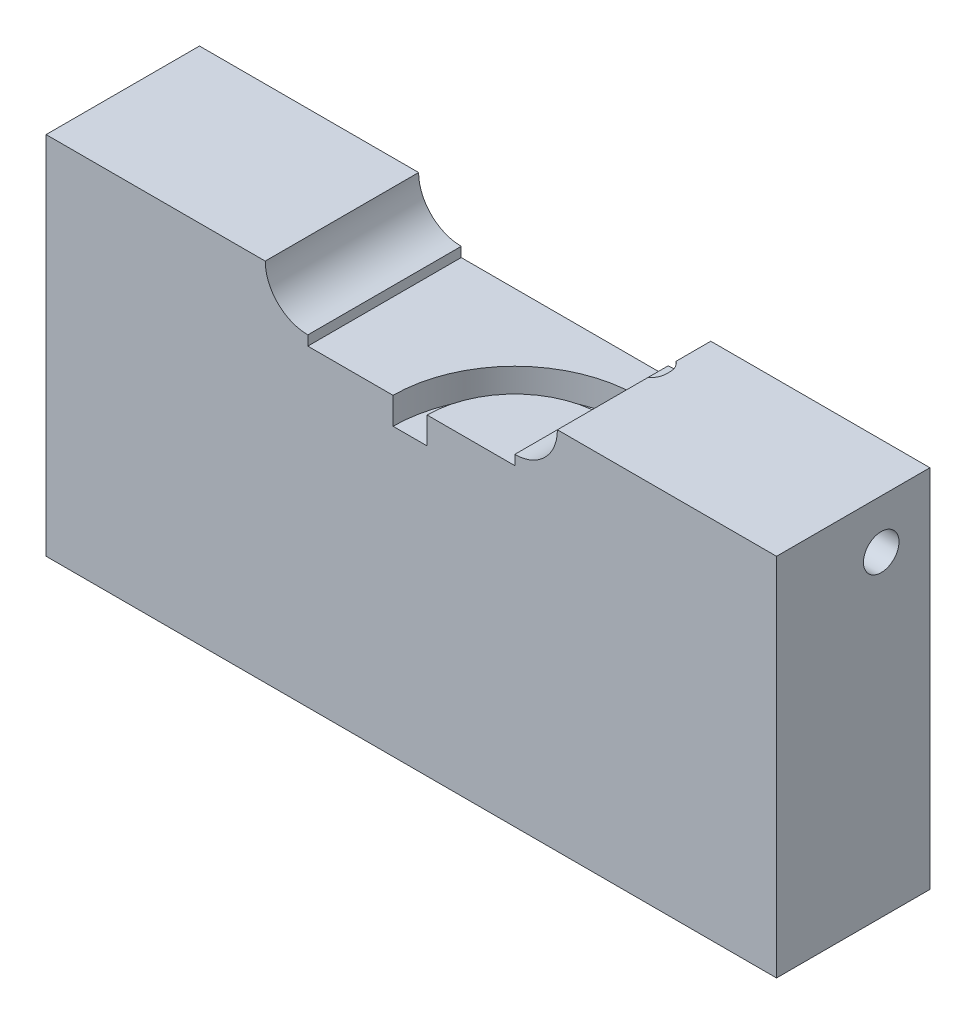
ISO-10303-21;
HEADER;
FILE_DESCRIPTION(('STEP AP214'),'2;1');
FILE_NAME('part.step','',(''),(''),'','','');
FILE_SCHEMA(('AUTOMOTIVE_DESIGN { 1 0 10303 214 1 1 1 1 }'));
ENDSEC;
DATA;
#1=APPLICATION_CONTEXT('core data for automotive mechanical design processes');
#2=APPLICATION_PROTOCOL_DEFINITION('international standard','automotive_design',2000,#1);
#3=PRODUCT_CONTEXT('',#1,'mechanical');
#4=PRODUCT('Part','Part','',(#3));
#5=PRODUCT_RELATED_PRODUCT_CATEGORY('part','',(#4));
#6=PRODUCT_DEFINITION_FORMATION('','',#4);
#7=PRODUCT_DEFINITION_CONTEXT('part definition',#1,'design');
#8=PRODUCT_DEFINITION('design','',#6,#7);
#9=PRODUCT_DEFINITION_SHAPE('','',#8);
#10=(LENGTH_UNIT() NAMED_UNIT(*) SI_UNIT(.MILLI.,.METRE.));
#11=(NAMED_UNIT(*) PLANE_ANGLE_UNIT() SI_UNIT($,.RADIAN.));
#12=(NAMED_UNIT(*) SI_UNIT($,.STERADIAN.) SOLID_ANGLE_UNIT());
#13=UNCERTAINTY_MEASURE_WITH_UNIT(LENGTH_MEASURE(1.E-05),#10,'distance_accuracy_value','');
#14=(GEOMETRIC_REPRESENTATION_CONTEXT(3) GLOBAL_UNCERTAINTY_ASSIGNED_CONTEXT((#13)) GLOBAL_UNIT_ASSIGNED_CONTEXT((#10,
#11,#12)) REPRESENTATION_CONTEXT('',''));
#15=CARTESIAN_POINT('',(0.,0.,0.));
#16=DIRECTION('',(0.,0.,1.));
#17=DIRECTION('',(1.,0.,0.));
#18=AXIS2_PLACEMENT_3D('',#15,#16,#17);
#19=CARTESIAN_POINT('',(5.39750000000001,19.05,4.0005));
#20=DIRECTION('',(0.,-1.,0.));
#21=DIRECTION('',(1.,0.,0.));
#22=AXIS2_PLACEMENT_3D('',#19,#20,#21);
#23=CYLINDRICAL_SURFACE('',#22,6.35);
#24=DIRECTION('',(0.,-1.,0.));
#25=VECTOR('',#24,1.);
#26=CARTESIAN_POINT('',(5.3975,19.05,-2.3495));
#27=LINE('',#26,#25);
#28=CARTESIAN_POINT('',(5.3975,16.3195,-2.3495));
#29=VERTEX_POINT('',#28);
#30=CARTESIAN_POINT('',(5.3975,14.9225,-2.3495));
#31=VERTEX_POINT('',#30);
#32=EDGE_CURVE('E452',#29,#31,#27,.T.);
#33=ORIENTED_EDGE('',*,*,#32,.F.);
#34=CARTESIAN_POINT('',(5.3975,16.3195,4.0005));
#35=DIRECTION('',(0.,1.,0.));
#36=DIRECTION('',(-1.,0.,0.));
#37=AXIS2_PLACEMENT_3D('',#34,#35,#36);
#38=CIRCLE('',#37,6.35);
#39=CARTESIAN_POINT('',(-0.952499999999995,16.3195,4.0005));
#40=VERTEX_POINT('',#39);
#41=EDGE_CURVE('E239',#29,#40,#38,.T.);
#42=ORIENTED_EDGE('',*,*,#41,.T.);
#43=DIRECTION('',(0.,-1.,0.));
#44=VECTOR('',#43,1.);
#45=CARTESIAN_POINT('',(-0.952499999999994,19.05,4.0005));
#46=LINE('',#45,#44);
#47=CARTESIAN_POINT('',(-0.952499999999996,14.9225,4.0005));
#48=VERTEX_POINT('',#47);
#49=EDGE_CURVE('E230',#40,#48,#46,.T.);
#50=ORIENTED_EDGE('',*,*,#49,.T.);
#51=CARTESIAN_POINT('',(5.3975,14.9225,4.0005));
#52=DIRECTION('',(0.,1.,0.));
#53=DIRECTION('',(-1.,0.,0.));
#54=AXIS2_PLACEMENT_3D('',#51,#52,#53);
#55=CIRCLE('',#54,6.35);
#56=EDGE_CURVE('E468',#31,#48,#55,.T.);
#57=ORIENTED_EDGE('',*,*,#56,.F.);
#58=EDGE_LOOP('',(#33,#42,#50,#57));
#59=FACE_BOUND('',#58,.T.);
#60=ADVANCED_FACE('F33',(#59),#23,.F.);
#61=CARTESIAN_POINT('',(5.39750000000001,19.05,4.0005));
#62=DIRECTION('',(0.,-1.,0.));
#63=DIRECTION('',(1.,0.,0.));
#64=AXIS2_PLACEMENT_3D('',#61,#62,#63);
#65=CYLINDRICAL_SURFACE('',#64,4.572);
#66=DIRECTION('',(0.,-1.,0.));
#67=VECTOR('',#66,1.);
#68=CARTESIAN_POINT('',(0.825500000000006,19.05,4.0005));
#69=LINE('',#68,#67);
#70=CARTESIAN_POINT('',(0.825500000000005,16.3195,4.0005));
#71=VERTEX_POINT('',#70);
#72=CARTESIAN_POINT('',(0.825500000000005,14.9225,4.0005));
#73=VERTEX_POINT('',#72);
#74=EDGE_CURVE('E450',#71,#73,#69,.T.);
#75=ORIENTED_EDGE('',*,*,#74,.F.);
#76=CARTESIAN_POINT('',(5.3975,16.3195,4.0005));
#77=DIRECTION('',(0.,1.,0.));
#78=DIRECTION('',(-1.,0.,0.));
#79=AXIS2_PLACEMENT_3D('',#76,#77,#78);
#80=CIRCLE('',#79,4.572);
#81=CARTESIAN_POINT('',(5.3975,16.3195,-0.571499999999999));
#82=VERTEX_POINT('',#81);
#83=EDGE_CURVE('E11',#71,#82,#80,.F.);
#84=ORIENTED_EDGE('',*,*,#83,.T.);
#85=DIRECTION('',(0.,-1.,0.));
#86=VECTOR('',#85,1.);
#87=CARTESIAN_POINT('',(5.39750000000001,19.05,-0.571499999999999));
#88=LINE('',#87,#86);
#89=CARTESIAN_POINT('',(5.3975,14.9225,-0.571499999999999));
#90=VERTEX_POINT('',#89);
#91=EDGE_CURVE('E428',#82,#90,#88,.T.);
#92=ORIENTED_EDGE('',*,*,#91,.T.);
#93=CARTESIAN_POINT('',(5.3975,14.9225,4.0005));
#94=DIRECTION('',(0.,-1.,0.));
#95=DIRECTION('',(-1.,0.,0.));
#96=AXIS2_PLACEMENT_3D('',#93,#94,#95);
#97=CIRCLE('',#96,4.572);
#98=EDGE_CURVE('E444',#73,#90,#97,.T.);
#99=ORIENTED_EDGE('',*,*,#98,.F.);
#100=EDGE_LOOP('',(#75,#84,#92,#99));
#101=FACE_BOUND('',#100,.T.);
#102=ADVANCED_FACE('F515',(#101),#65,.T.);
#103=CARTESIAN_POINT('',(7.14375,19.05,-1.36525));
#104=DIRECTION('',(0.,-1.,0.));
#105=DIRECTION('',(1.,0.,0.));
#106=AXIS2_PLACEMENT_3D('',#103,#104,#105);
#107=CYLINDRICAL_SURFACE('',#106,0.79375);
#108=CARTESIAN_POINT('',(7.14375,16.7730464027505,-0.571499999999999));
#109=CARTESIAN_POINT('',(7.15893791785662,16.7729781622669,-0.57148921704763));
#110=CARTESIAN_POINT('',(7.17400569118337,16.774520458918,-0.571934888400934));
#111=CARTESIAN_POINT('',(7.2033431203434,16.7800966910771,-0.573609679749041));
#112=CARTESIAN_POINT('',(7.21762258038871,16.7840818079715,-0.574823464377439));
#113=CARTESIAN_POINT('',(7.2538046947155,16.7968082711699,-0.578843564999055));
#114=CARTESIAN_POINT('',(7.27512209176527,16.8069686475094,-0.582168697431571));
#115=CARTESIAN_POINT('',(7.31633968048021,16.8297623078841,-0.590203083478792));
#116=CARTESIAN_POINT('',(7.3362195987784,16.8424240312471,-0.594928600893243));
#117=CARTESIAN_POINT('',(7.37787042940221,16.8711125710446,-0.606458135167337));
#118=CARTESIAN_POINT('',(7.39943301006976,16.8873533586215,-0.613473986199112));
#119=CARTESIAN_POINT('',(7.44138305141543,16.920593693588,-0.629075213734984));
#120=CARTESIAN_POINT('',(7.46176933083154,16.9375939742988,-0.637662133053712));
#121=CARTESIAN_POINT('',(7.52143193640342,16.9889203174978,-0.665728056056787));
#122=CARTESIAN_POINT('',(7.5593005677582,17.0236393239732,-0.687537596010284));
#123=CARTESIAN_POINT('',(7.63841851328631,17.098430775985,-0.742299278746401));
#124=CARTESIAN_POINT('',(7.67896795887998,17.1382846809269,-0.776574581298044));
#125=CARTESIAN_POINT('',(7.75403094099643,17.2140168410449,-0.854840077472445));
#126=CARTESIAN_POINT('',(7.78855810799547,17.2499040050053,-0.898807808999805));
#127=CARTESIAN_POINT('',(7.83769152755566,17.3026476479051,-0.97824481695104));
#128=CARTESIAN_POINT('',(7.85491185054323,17.3215928274382,-1.01071440914582));
#129=CARTESIAN_POINT('',(7.88511096397852,17.3559280219605,-1.07921260408973));
#130=CARTESIAN_POINT('',(7.89810333803432,17.371329374934,-1.11522931488016));
#131=CARTESIAN_POINT('',(7.91781786866114,17.3962994434745,-1.18619777652733));
#132=CARTESIAN_POINT('',(7.92506881061527,17.4063207127409,-1.22083829691442));
#133=CARTESIAN_POINT('',(7.93245517265907,17.418352232104,-1.27409390820123));
#134=CARTESIAN_POINT('',(7.93433608261142,17.4218715687023,-1.29214513676568));
#135=CARTESIAN_POINT('',(7.93686009185863,17.4278440916586,-1.3285246385013));
#136=CARTESIAN_POINT('',(7.93750208529729,17.4302963240094,-1.34685314447942));
#137=CARTESIAN_POINT('',(7.9375,17.432194040048,-1.36525));
#138=B_SPLINE_CURVE_WITH_KNOTS('',3,(#108,#109,#110,#111,#112,#113,#114,#115,#116,#117,#118,
#119,#120,#121,#122,#123,#124,#125,#126,#127,#128,#129,#130,#131,#132,#133,#134,#135,#136,#137),
.UNSPECIFIED.,.F.,.F.,(4,2,2,2,2,2,2,2,2,2,2,2,2,2,4),(0.,0.0452895664750743,0.0897022840237438,
0.160849075138673,0.232856893385683,0.316417547963794,0.400060705247954,0.567007309525601,
0.765293828106061,0.963125562501132,1.08674096362217,1.2099551978823,1.31975004138662,
1.37514445888962,1.43058829859037),.UNSPECIFIED.);
#139=CARTESIAN_POINT('',(7.14375,16.7730464027505,-0.571499999999999));
#140=VERTEX_POINT('',#139);
#141=CARTESIAN_POINT('',(7.9375,17.432194040048,-1.36525));
#142=VERTEX_POINT('',#141);
#143=EDGE_CURVE('E288',#140,#142,#138,.T.);
#144=ORIENTED_EDGE('',*,*,#143,.F.);
#145=DIRECTION('',(0.,-1.,0.));
#146=VECTOR('',#145,1.);
#147=CARTESIAN_POINT('',(7.14375,19.05,-0.571499999999999));
#148=LINE('',#147,#146);
#149=CARTESIAN_POINT('',(7.14375,17.6751846714922,-0.571499999999999));
#150=VERTEX_POINT('',#149);
#151=EDGE_CURVE('E420',#150,#140,#148,.T.);
#152=ORIENTED_EDGE('',*,*,#151,.F.);
#153=CARTESIAN_POINT('',(7.14375,17.6751846714922,-0.571499999999999));
#154=CARTESIAN_POINT('',(7.17493882903405,17.7147904593139,-0.571515966067028));
#155=CARTESIAN_POINT('',(7.20473558813774,17.7554189700609,-0.573336101510383));
#156=CARTESIAN_POINT('',(7.26136996565832,17.8383868944046,-0.579743127296266));
#157=CARTESIAN_POINT('',(7.28821258149454,17.8807232477426,-0.58432525746599));
#158=CARTESIAN_POINT('',(7.33890986333421,17.966975133551,-0.595428843915839));
#159=CARTESIAN_POINT('',(7.36275997006246,18.0108929475555,-0.601953209514282));
#160=CARTESIAN_POINT('',(7.40738778736858,18.1000808312739,-0.616195180263885));
#161=CARTESIAN_POINT('',(7.42816405256461,18.1453515251891,-0.623913343295498));
#162=CARTESIAN_POINT('',(7.48841301880205,18.2891746871459,-0.64885679832621));
#163=CARTESIAN_POINT('',(7.52239504808017,18.3899758849743,-0.666944970405778));
#164=CARTESIAN_POINT('',(7.56234987491672,18.54428448952,-0.690674889170688));
#165=CARTESIAN_POINT('',(7.57382524483122,18.5961801786835,-0.698011648198737));
#166=CARTESIAN_POINT('',(7.59305267803054,18.7008824439455,-0.710803547908302));
#167=CARTESIAN_POINT('',(7.6008067955423,18.7536885007802,-0.716259726248792));
#168=CARTESIAN_POINT('',(7.61108668898027,18.8470681393693,-0.723637621390586));
#169=CARTESIAN_POINT('',(7.6144233283184,18.8875119988091,-0.72609497073602));
#170=CARTESIAN_POINT('',(7.61888265518496,18.9686335235272,-0.729411979066941));
#171=CARTESIAN_POINT('',(7.62000273710662,19.009311407665,-0.730269757657388));
#172=CARTESIAN_POINT('',(7.62000000000001,19.05,-0.73025));
#173=B_SPLINE_CURVE_WITH_KNOTS('',3,(#153,#154,#155,#156,#157,#158,#159,#160,#161,#162,#163,
#164,#165,#166,#167,#168,#169,#170,#171,#172),.UNSPECIFIED.,.F.,.F.,(4,2,2,2,2,2,2,2,2,4),(0.,
0.151091968467235,0.301924278346462,0.452983670059188,0.604113868697305,0.926493060198711,
1.08733203777103,1.2480821256733,1.36996150858662,1.49198407820245),.UNSPECIFIED.);
#174=CARTESIAN_POINT('',(7.62000000000001,19.05,-0.73025));
#175=VERTEX_POINT('',#174);
#176=EDGE_CURVE('E310',#150,#175,#173,.T.);
#177=ORIENTED_EDGE('',*,*,#176,.T.);
#178=CARTESIAN_POINT('',(7.14375,19.05,-1.36525));
#179=DIRECTION('',(0.,1.,0.));
#180=DIRECTION('',(1.,0.,0.));
#181=AXIS2_PLACEMENT_3D('',#178,#179,#180);
#182=CIRCLE('',#181,0.79375);
#183=CARTESIAN_POINT('',(7.9375,19.05,-1.36525));
#184=VERTEX_POINT('',#183);
#185=EDGE_CURVE('E438',#175,#184,#182,.T.);
#186=ORIENTED_EDGE('',*,*,#185,.T.);
#187=DIRECTION('',(0.,-1.,0.));
#188=VECTOR('',#187,1.);
#189=CARTESIAN_POINT('',(7.9375,19.05,-1.36525));
#190=LINE('',#189,#188);
#191=EDGE_CURVE('E355',#184,#142,#190,.T.);
#192=ORIENTED_EDGE('',*,*,#191,.T.);
#193=EDGE_LOOP('',(#144,#152,#177,#186,#192));
#194=FACE_BOUND('',#193,.T.);
#195=ADVANCED_FACE('F302',(#194),#107,.F.);
#196=CARTESIAN_POINT('',(7.14375,19.05,-1.55575));
#197=DIRECTION('',(0.,-1.,0.));
#198=DIRECTION('',(1.,0.,0.));
#199=AXIS2_PLACEMENT_3D('',#196,#197,#198);
#200=CYLINDRICAL_SURFACE('',#199,0.79375);
#201=CARTESIAN_POINT('',(7.9375,17.432194040048,-1.55575));
#202=CARTESIAN_POINT('',(7.93750241256333,17.4301936525798,-1.57514478348495));
#203=CARTESIAN_POINT('',(7.93678870871886,17.4275767551003,-1.5944621743929));
#204=CARTESIAN_POINT('',(7.93398641219166,17.4211587801819,-1.63277953405351));
#205=CARTESIAN_POINT('',(7.93189915885153,17.4173588582055,-1.65177979355258));
#206=CARTESIAN_POINT('',(7.92371352293546,17.4043339271178,-1.70775715508424));
#207=CARTESIAN_POINT('',(7.91568889593078,17.3934433707352,-1.74408855282001));
#208=CARTESIAN_POINT('',(7.895237760106,17.3679176659708,-1.81387248338225));
#209=CARTESIAN_POINT('',(7.88282703010999,17.3532959918654,-1.8473348082929));
#210=CARTESIAN_POINT('',(7.85435108605226,17.3209943364583,-1.9111502135495));
#211=CARTESIAN_POINT('',(7.83827706911014,17.3033070133269,-1.9414955446917));
#212=CARTESIAN_POINT('',(7.7950458041358,17.2568268517615,-2.01212150391445));
#213=CARTESIAN_POINT('',(7.76620526596445,17.2266872046281,-2.05048526942747));
#214=CARTESIAN_POINT('',(7.7038617611406,17.1631883580013,-2.12011411534587));
#215=CARTESIAN_POINT('',(7.67034850885851,17.1298221071251,-2.1513631238535));
#216=CARTESIAN_POINT('',(7.59865541927082,17.0604677895308,-2.20785803437785));
#217=CARTESIAN_POINT('',(7.56037261542773,17.0244328617208,-2.23291527401671));
#218=CARTESIAN_POINT('',(7.50013032175957,16.9706006600362,-2.26536164838984));
#219=CARTESIAN_POINT('',(7.47959277776843,16.9527037493227,-2.27531618012629));
#220=CARTESIAN_POINT('',(7.43740812370542,16.9173727822183,-2.29353925463318));
#221=CARTESIAN_POINT('',(7.41576180347949,16.899938409412,-2.30180897725127));
#222=CARTESIAN_POINT('',(7.37545059999082,16.8695567149893,-2.31516497950012));
#223=CARTESIAN_POINT('',(7.35704266951006,16.856403873353,-2.32055739616009));
#224=CARTESIAN_POINT('',(7.31896103433902,16.8315037640402,-2.33017004709823));
#225=CARTESIAN_POINT('',(7.29928734644973,16.819756477713,-2.33439029693117));
#226=CARTESIAN_POINT('',(7.26442510912181,16.8021227309386,-2.34040819331776));
#227=CARTESIAN_POINT('',(7.2496600372804,16.7955350172339,-2.34255282231827));
#228=CARTESIAN_POINT('',(7.21928974650044,16.784519893377,-2.34604332277608));
#229=CARTESIAN_POINT('',(7.2036895553853,16.7800808834197,-2.34739349186303));
#230=CARTESIAN_POINT('',(7.18055609109639,16.7758076177804,-2.34867942917183));
#231=CARTESIAN_POINT('',(7.17325894960944,16.7747822406778,-2.34898501857166));
#232=CARTESIAN_POINT('',(7.15856018619977,16.7733972488647,-2.34939622095228));
#233=CARTESIAN_POINT('',(7.15115822518164,16.7730409698786,-2.34950083203409));
#234=CARTESIAN_POINT('',(7.14375,16.7730464027505,-2.3495));
#235=B_SPLINE_CURVE_WITH_KNOTS('',3,(#201,#202,#203,#204,#205,#206,#207,#208,#209,#210,#211,
#212,#213,#214,#215,#216,#217,#218,#219,#220,#221,#222,#223,#224,#225,#226,#227,#228,#229,#230,
#231,#232,#233,#234),.UNSPECIFIED.,.F.,.F.,(4,2,2,2,2,2,2,2,2,2,2,2,2,2,2,2,4),(0.,
0.0584453265147484,0.1168337475043,0.232488737897986,0.347731829907222,0.463254826944109,
0.632339979221339,0.801803378714479,0.975925812136694,1.06288483108186,1.14978274295621,
1.21949579483512,1.28920792157083,1.33802178064912,1.38656909412918,1.40866379827516,
1.43086836401874),.UNSPECIFIED.);
#236=CARTESIAN_POINT('',(7.9375,17.432194040048,-1.55575));
#237=VERTEX_POINT('',#236);
#238=CARTESIAN_POINT('',(7.14375,16.7730464027505,-2.3495));
#239=VERTEX_POINT('',#238);
#240=EDGE_CURVE('E283',#237,#239,#235,.T.);
#241=ORIENTED_EDGE('',*,*,#240,.F.);
#242=DIRECTION('',(0.,-1.,0.));
#243=VECTOR('',#242,1.);
#244=CARTESIAN_POINT('',(7.9375,19.05,-1.55575));
#245=LINE('',#244,#243);
#246=CARTESIAN_POINT('',(7.9375,19.05,-1.55575));
#247=VERTEX_POINT('',#246);
#248=EDGE_CURVE('E345',#247,#237,#245,.T.);
#249=ORIENTED_EDGE('',*,*,#248,.F.);
#250=CARTESIAN_POINT('',(7.14375,19.05,-1.55575));
#251=DIRECTION('',(0.,1.,0.));
#252=DIRECTION('',(-1.,0.,0.));
#253=AXIS2_PLACEMENT_3D('',#250,#251,#252);
#254=CIRCLE('',#253,0.79375);
#255=CARTESIAN_POINT('',(7.62000000000001,19.05,-2.19075));
#256=VERTEX_POINT('',#255);
#257=EDGE_CURVE('E441',#247,#256,#254,.T.);
#258=ORIENTED_EDGE('',*,*,#257,.T.);
#259=CARTESIAN_POINT('',(7.62000000000001,19.05,-2.19075));
#260=CARTESIAN_POINT('',(7.62000808222505,18.9976620086764,-2.19069678540611));
#261=CARTESIAN_POINT('',(7.61815174304965,18.9453473715379,-2.19213629686458));
#262=CARTESIAN_POINT('',(7.61078125391763,18.8411829924741,-2.19758908145641));
#263=CARTESIAN_POINT('',(7.60527233116839,18.7893326933517,-2.20159867627471));
#264=CARTESIAN_POINT('',(7.59066211493762,18.6863268479517,-2.21178576557001));
#265=CARTESIAN_POINT('',(7.58155825030525,18.6351718260926,-2.21796481131604));
#266=CARTESIAN_POINT('',(7.5598465844707,18.5338125931217,-2.23181870998652));
#267=CARTESIAN_POINT('',(7.54723754530961,18.4836087246421,-2.23949409110067));
#268=CARTESIAN_POINT('',(7.50289921844771,18.3299016765049,-2.26443820747756));
#269=CARTESIAN_POINT('',(7.46535418005993,18.2282472369929,-2.2830066799425));
#270=CARTESIAN_POINT('',(7.37568261057652,18.0312061917664,-2.31636202096677));
#271=CARTESIAN_POINT('',(7.32360883953245,17.9357984212855,-2.33116220863326));
#272=CARTESIAN_POINT('',(7.24582277866171,17.8153311257624,-2.3431368661238));
#273=CARTESIAN_POINT('',(7.22636452973084,17.7866863514485,-2.34544747485569));
#274=CARTESIAN_POINT('',(7.18607326983956,17.7302594935604,-2.34862852535922));
#275=CARTESIAN_POINT('',(7.16523897881772,17.7024782496364,-2.34949760595795));
#276=CARTESIAN_POINT('',(7.14375,17.6751846714922,-2.3495));
#277=B_SPLINE_CURVE_WITH_KNOTS('',3,(#259,#260,#261,#262,#263,#264,#265,#266,#267,#268,#269,
#270,#271,#272,#273,#274,#275,#276),.UNSPECIFIED.,.F.,.F.,(4,2,2,2,2,2,2,2,4),(0.,
0.156923704265635,0.313623318561804,0.470435210112982,0.62730255506631,0.955983364493296,
1.28348578985539,1.3875449931461,1.49170239923897),.UNSPECIFIED.);
#278=CARTESIAN_POINT('',(7.14375,17.6751846714922,-2.3495));
#279=VERTEX_POINT('',#278);
#280=EDGE_CURVE('E321',#256,#279,#277,.T.);
#281=ORIENTED_EDGE('',*,*,#280,.T.);
#282=DIRECTION('',(0.,-1.,0.));
#283=VECTOR('',#282,1.);
#284=CARTESIAN_POINT('',(7.14375,19.05,-2.3495));
#285=LINE('',#284,#283);
#286=EDGE_CURVE('E348',#279,#239,#285,.T.);
#287=ORIENTED_EDGE('',*,*,#286,.T.);
#288=EDGE_LOOP('',(#241,#249,#258,#281,#287));
#289=FACE_BOUND('',#288,.T.);
#290=ADVANCED_FACE('F344',(#289),#200,.F.);
#291=CARTESIAN_POINT('',(7.9375,19.05,-1.36525));
#292=DIRECTION('',(-1.,0.,0.));
#293=DIRECTION('',(0.,-1.,0.));
#294=AXIS2_PLACEMENT_3D('',#291,#292,#293);
#295=PLANE('',#294);
#296=CARTESIAN_POINT('',(7.9375,16.51,-1.4605));
#297=DIRECTION('',(-1.,0.,0.));
#298=DIRECTION('',(0.,-1.,0.));
#299=AXIS2_PLACEMENT_3D('',#296,#297,#298);
#300=CIRCLE('',#299,0.9271);
#301=EDGE_CURVE('E327',#142,#237,#300,.T.);
#302=ORIENTED_EDGE('',*,*,#301,.F.);
#303=ORIENTED_EDGE('',*,*,#191,.F.);
#304=DIRECTION('',(0.,0.,-1.));
#305=VECTOR('',#304,1.);
#306=CARTESIAN_POINT('',(7.9375,19.05,-1.36525));
#307=LINE('',#306,#305);
#308=EDGE_CURVE('E351',#184,#247,#307,.T.);
#309=ORIENTED_EDGE('',*,*,#308,.T.);
#310=ORIENTED_EDGE('',*,*,#248,.T.);
#311=EDGE_LOOP('',(#302,#303,#309,#310));
#312=FACE_BOUND('',#311,.T.);
#313=ADVANCED_FACE('F349',(#312),#295,.T.);
#314=CARTESIAN_POINT('',(-19.05,19.05,4.0005));
#315=DIRECTION('',(0.,0.,-1.));
#316=DIRECTION('',(-1.,0.,0.));
#317=AXIS2_PLACEMENT_3D('',#314,#315,#316);
#318=PLANE('',#317);
#319=DIRECTION('',(1.,0.,0.));
#320=VECTOR('',#319,1.);
#321=CARTESIAN_POINT('',(-5.3975,16.3195,4.0005));
#322=LINE('',#321,#320);
#323=CARTESIAN_POINT('',(-5.3975,16.3195,4.0005));
#324=VERTEX_POINT('',#323);
#325=EDGE_CURVE('E221',#324,#40,#322,.T.);
#326=ORIENTED_EDGE('',*,*,#325,.F.);
#327=DIRECTION('',(0.,1.,0.));
#328=VECTOR('',#327,1.);
#329=CARTESIAN_POINT('',(-5.3975,16.3195,4.0005));
#330=LINE('',#329,#328);
#331=CARTESIAN_POINT('',(-5.3975,16.8275,4.0005));
#332=VERTEX_POINT('',#331);
#333=EDGE_CURVE('E205',#324,#332,#330,.T.);
#334=ORIENTED_EDGE('',*,*,#333,.T.);
#335=CARTESIAN_POINT('',(-5.39749999999999,19.05,4.0005));
#336=DIRECTION('',(0.,0.,-1.));
#337=DIRECTION('',(-1.,0.,0.));
#338=AXIS2_PLACEMENT_3D('',#335,#336,#337);
#339=CIRCLE('',#338,2.2225);
#340=CARTESIAN_POINT('',(-7.61999999999999,19.05,4.0005));
#341=VERTEX_POINT('',#340);
#342=EDGE_CURVE('E372',#332,#341,#339,.T.);
#343=ORIENTED_EDGE('',*,*,#342,.T.);
#344=DIRECTION('',(1.,0.,0.));
#345=VECTOR('',#344,1.);
#346=CARTESIAN_POINT('',(-19.05,19.05,4.0005));
#347=LINE('',#346,#345);
#348=CARTESIAN_POINT('',(-19.05,19.05,4.0005));
#349=VERTEX_POINT('',#348);
#350=EDGE_CURVE('E386',#349,#341,#347,.T.);
#351=ORIENTED_EDGE('',*,*,#350,.F.);
#352=DIRECTION('',(0.,-1.,0.));
#353=VECTOR('',#352,1.);
#354=CARTESIAN_POINT('',(-19.05,19.05,4.0005));
#355=LINE('',#354,#353);
#356=CARTESIAN_POINT('',(-19.05,0.,4.0005));
#357=VERTEX_POINT('',#356);
#358=EDGE_CURVE('E399',#349,#357,#355,.T.);
#359=ORIENTED_EDGE('',*,*,#358,.T.);
#360=DIRECTION('',(1.,0.,0.));
#361=VECTOR('',#360,1.);
#362=CARTESIAN_POINT('',(-19.05,0.,4.0005));
#363=LINE('',#362,#361);
#364=CARTESIAN_POINT('',(19.05,0.,4.0005));
#365=VERTEX_POINT('',#364);
#366=EDGE_CURVE('E379',#357,#365,#363,.T.);
#367=ORIENTED_EDGE('',*,*,#366,.T.);
#368=DIRECTION('',(0.,-1.,0.));
#369=VECTOR('',#368,1.);
#370=CARTESIAN_POINT('',(19.05,19.05,4.0005));
#371=LINE('',#370,#369);
#372=CARTESIAN_POINT('',(19.05,19.05,4.0005));
#373=VERTEX_POINT('',#372);
#374=EDGE_CURVE('E389',#373,#365,#371,.T.);
#375=ORIENTED_EDGE('',*,*,#374,.F.);
#376=CARTESIAN_POINT('',(7.62,19.05,4.0005));
#377=VERTEX_POINT('',#376);
#378=EDGE_CURVE('E385',#377,#373,#347,.T.);
#379=ORIENTED_EDGE('',*,*,#378,.F.);
#380=CARTESIAN_POINT('',(5.3975,19.05,4.0005));
#381=DIRECTION('',(0.,0.,-1.));
#382=DIRECTION('',(-1.,0.,0.));
#383=AXIS2_PLACEMENT_3D('',#380,#381,#382);
#384=CIRCLE('',#383,2.2225);
#385=CARTESIAN_POINT('',(5.3975,16.8275,4.0005));
#386=VERTEX_POINT('',#385);
#387=EDGE_CURVE('E367',#377,#386,#384,.T.);
#388=ORIENTED_EDGE('',*,*,#387,.T.);
#389=DIRECTION('',(0.,1.,0.));
#390=VECTOR('',#389,1.);
#391=CARTESIAN_POINT('',(5.3975,16.3195,4.0005));
#392=LINE('',#391,#390);
#393=CARTESIAN_POINT('',(5.3975,16.3195,4.0005));
#394=VERTEX_POINT('',#393);
#395=EDGE_CURVE('E216',#394,#386,#392,.T.);
#396=ORIENTED_EDGE('',*,*,#395,.F.);
#397=EDGE_CURVE('E225',#71,#394,#322,.T.);
#398=ORIENTED_EDGE('',*,*,#397,.F.);
#399=ORIENTED_EDGE('',*,*,#74,.T.);
#400=DIRECTION('',(1.,0.,0.));
#401=VECTOR('',#400,1.);
#402=CARTESIAN_POINT('',(0.825500000000005,14.9225,4.0005));
#403=LINE('',#402,#401);
#404=EDGE_CURVE('E471',#48,#73,#403,.T.);
#405=ORIENTED_EDGE('',*,*,#404,.F.);
#406=ORIENTED_EDGE('',*,*,#49,.F.);
#407=EDGE_LOOP('',(#326,#334,#343,#351,#359,#367,#375,#379,#388,#396,#398,#399,#405,#406));
#408=FACE_BOUND('',#407,.T.);
#409=ADVANCED_FACE('F228',(#408),#318,.F.);
#410=CARTESIAN_POINT('',(0.,19.05,0.));
#411=DIRECTION('',(0.,-1.,0.));
#412=DIRECTION('',(0.,0.,-1.));
#413=AXIS2_PLACEMENT_3D('',#410,#411,#412);
#414=PLANE('',#413);
#415=ORIENTED_EDGE('',*,*,#185,.F.);
#416=DIRECTION('',(0.,0.,-1.));
#417=VECTOR('',#416,1.);
#418=CARTESIAN_POINT('',(7.62000000000001,19.05,21.3995));
#419=LINE('',#418,#417);
#420=EDGE_CURVE('E408',#175,#377,#419,.F.);
#421=ORIENTED_EDGE('',*,*,#420,.T.);
#422=ORIENTED_EDGE('',*,*,#378,.T.);
#423=DIRECTION('',(0.,0.,-1.));
#424=VECTOR('',#423,1.);
#425=CARTESIAN_POINT('',(19.05,19.05,4.0005));
#426=LINE('',#425,#424);
#427=CARTESIAN_POINT('',(19.05,19.05,-4.0005));
#428=VERTEX_POINT('',#427);
#429=EDGE_CURVE('E375',#373,#428,#426,.T.);
#430=ORIENTED_EDGE('',*,*,#429,.T.);
#431=DIRECTION('',(-1.,0.,0.));
#432=VECTOR('',#431,1.);
#433=CARTESIAN_POINT('',(-19.05,19.05,-4.0005));
#434=LINE('',#433,#432);
#435=CARTESIAN_POINT('',(7.62000000000001,19.05,-4.0005));
#436=VERTEX_POINT('',#435);
#437=EDGE_CURVE('E380',#428,#436,#434,.T.);
#438=ORIENTED_EDGE('',*,*,#437,.T.);
#439=EDGE_CURVE('E409',#436,#256,#419,.F.);
#440=ORIENTED_EDGE('',*,*,#439,.T.);
#441=ORIENTED_EDGE('',*,*,#257,.F.);
#442=ORIENTED_EDGE('',*,*,#308,.F.);
#443=EDGE_LOOP('',(#415,#421,#422,#430,#438,#440,#441,#442));
#444=FACE_BOUND('',#443,.T.);
#445=ADVANCED_FACE('F436',(#444),#414,.F.);
#446=CARTESIAN_POINT('',(5.3975,19.05,21.3995));
#447=DIRECTION('',(0.,0.,-1.));
#448=DIRECTION('',(-1.,0.,0.));
#449=AXIS2_PLACEMENT_3D('',#446,#447,#448);
#450=CYLINDRICAL_SURFACE('',#449,2.2225);
#451=ORIENTED_EDGE('',*,*,#280,.F.);
#452=ORIENTED_EDGE('',*,*,#439,.F.);
#453=CARTESIAN_POINT('',(5.3975,19.05,-4.0005));
#454=DIRECTION('',(0.,0.,-1.));
#455=DIRECTION('',(-1.,0.,0.));
#456=AXIS2_PLACEMENT_3D('',#453,#454,#455);
#457=CIRCLE('',#456,2.2225);
#458=CARTESIAN_POINT('',(5.3975,16.8275,-4.0005));
#459=VERTEX_POINT('',#458);
#460=EDGE_CURVE('E362',#436,#459,#457,.T.);
#461=ORIENTED_EDGE('',*,*,#460,.T.);
#462=DIRECTION('',(0.,0.,-1.));
#463=VECTOR('',#462,1.);
#464=CARTESIAN_POINT('',(5.3975,16.8275,21.3995));
#465=LINE('',#464,#463);
#466=CARTESIAN_POINT('',(5.3975,16.8275,-2.3495));
#467=VERTEX_POINT('',#466);
#468=EDGE_CURVE('E365',#467,#459,#465,.T.);
#469=ORIENTED_EDGE('',*,*,#468,.F.);
#470=CARTESIAN_POINT('',(5.3975,19.05,-2.3495));
#471=DIRECTION('',(0.,0.,1.));
#472=DIRECTION('',(1.,0.,0.));
#473=AXIS2_PLACEMENT_3D('',#470,#471,#472);
#474=CIRCLE('',#473,2.2225);
#475=EDGE_CURVE('E316',#279,#467,#474,.F.);
#476=ORIENTED_EDGE('',*,*,#475,.F.);
#477=EDGE_LOOP('',(#451,#452,#461,#469,#476));
#478=FACE_BOUND('',#477,.T.);
#479=ADVANCED_FACE('F304',(#478),#450,.F.);
#480=ORIENTED_EDGE('',*,*,#176,.F.);
#481=CARTESIAN_POINT('',(5.3975,19.05,-0.571499999999999));
#482=DIRECTION('',(0.,0.,-1.));
#483=DIRECTION('',(-1.,0.,0.));
#484=AXIS2_PLACEMENT_3D('',#481,#482,#483);
#485=CIRCLE('',#484,2.2225);
#486=CARTESIAN_POINT('',(5.3975,16.8275,-0.571499999999999));
#487=VERTEX_POINT('',#486);
#488=EDGE_CURVE('E317',#487,#150,#485,.F.);
#489=ORIENTED_EDGE('',*,*,#488,.F.);
#490=EDGE_CURVE('E368',#386,#487,#465,.T.);
#491=ORIENTED_EDGE('',*,*,#490,.F.);
#492=ORIENTED_EDGE('',*,*,#387,.F.);
#493=ORIENTED_EDGE('',*,*,#420,.F.);
#494=EDGE_LOOP('',(#480,#489,#491,#492,#493));
#495=FACE_BOUND('',#494,.T.);
#496=ADVANCED_FACE('F432',(#495),#450,.F.);
#497=ORIENTED_EDGE('',*,*,#350,.T.);
#498=DIRECTION('',(0.,0.,-1.));
#499=VECTOR('',#498,1.);
#500=CARTESIAN_POINT('',(-7.61999999999999,19.05,21.3995));
#501=LINE('',#500,#499);
#502=CARTESIAN_POINT('',(-7.61999999999999,19.05,-4.0005));
#503=VERTEX_POINT('',#502);
#504=EDGE_CURVE('E411',#341,#503,#501,.T.);
#505=ORIENTED_EDGE('',*,*,#504,.T.);
#506=CARTESIAN_POINT('',(-19.05,19.05,-4.0005));
#507=VERTEX_POINT('',#506);
#508=EDGE_CURVE('E378',#503,#507,#434,.T.);
#509=ORIENTED_EDGE('',*,*,#508,.T.);
#510=DIRECTION('',(0.,0.,1.));
#511=VECTOR('',#510,1.);
#512=CARTESIAN_POINT('',(-19.05,19.05,4.0005));
#513=LINE('',#512,#511);
#514=EDGE_CURVE('E383',#507,#349,#513,.T.);
#515=ORIENTED_EDGE('',*,*,#514,.T.);
#516=EDGE_LOOP('',(#497,#505,#509,#515));
#517=FACE_BOUND('',#516,.T.);
#518=ADVANCED_FACE('F572',(#517),#414,.F.);
#519=CARTESIAN_POINT('',(19.05,19.05,4.0005));
#520=DIRECTION('',(-1.,0.,0.));
#521=DIRECTION('',(0.,0.,1.));
#522=AXIS2_PLACEMENT_3D('',#519,#520,#521);
#523=PLANE('',#522);
#524=CARTESIAN_POINT('',(19.05,16.51,-1.4605));
#525=DIRECTION('',(1.,0.,0.));
#526=DIRECTION('',(0.,0.,-1.));
#527=AXIS2_PLACEMENT_3D('',#524,#525,#526);
#528=CIRCLE('',#527,0.9271);
#529=CARTESIAN_POINT('',(19.05,16.51,-2.3876));
#530=VERTEX_POINT('',#529);
#531=EDGE_CURVE('E245',#530,#530,#528,.T.);
#532=ORIENTED_EDGE('',*,*,#531,.F.);
#533=EDGE_LOOP('',(#532));
#534=FACE_BOUND('',#533,.T.);
#535=DIRECTION('',(0.,0.,-1.));
#536=VECTOR('',#535,1.);
#537=CARTESIAN_POINT('',(19.05,0.,4.0005));
#538=LINE('',#537,#536);
#539=CARTESIAN_POINT('',(19.05,0.,-4.0005));
#540=VERTEX_POINT('',#539);
#541=EDGE_CURVE('E374',#365,#540,#538,.T.);
#542=ORIENTED_EDGE('',*,*,#541,.T.);
#543=DIRECTION('',(0.,-1.,0.));
#544=VECTOR('',#543,1.);
#545=CARTESIAN_POINT('',(19.05,19.05,-4.0005));
#546=LINE('',#545,#544);
#547=EDGE_CURVE('E405',#428,#540,#546,.T.);
#548=ORIENTED_EDGE('',*,*,#547,.F.);
#549=ORIENTED_EDGE('',*,*,#429,.F.);
#550=ORIENTED_EDGE('',*,*,#374,.T.);
#551=EDGE_LOOP('',(#542,#548,#549,#550));
#552=FACE_BOUND('',#551,.T.);
#553=ADVANCED_FACE('F35',(#534,#552),#523,.F.);
#554=CARTESIAN_POINT('',(-19.05,19.05,-4.0005));
#555=DIRECTION('',(0.,0.,1.));
#556=DIRECTION('',(1.,0.,0.));
#557=AXIS2_PLACEMENT_3D('',#554,#555,#556);
#558=PLANE('',#557);
#559=CARTESIAN_POINT('',(-5.39749999999999,19.05,-4.0005));
#560=DIRECTION('',(0.,0.,-1.));
#561=DIRECTION('',(-1.,0.,0.));
#562=AXIS2_PLACEMENT_3D('',#559,#560,#561);
#563=CIRCLE('',#562,2.2225);
#564=CARTESIAN_POINT('',(-5.3975,16.8275,-4.0005));
#565=VERTEX_POINT('',#564);
#566=EDGE_CURVE('E360',#565,#503,#563,.T.);
#567=ORIENTED_EDGE('',*,*,#566,.F.);
#568=DIRECTION('',(0.,1.,0.));
#569=VECTOR('',#568,1.);
#570=CARTESIAN_POINT('',(-5.3975,16.3195,-4.0005));
#571=LINE('',#570,#569);
#572=CARTESIAN_POINT('',(-5.3975,16.3195,-4.0005));
#573=VERTEX_POINT('',#572);
#574=EDGE_CURVE('E237',#573,#565,#571,.T.);
#575=ORIENTED_EDGE('',*,*,#574,.F.);
#576=DIRECTION('',(-1.,0.,0.));
#577=VECTOR('',#576,1.);
#578=CARTESIAN_POINT('',(-5.3975,16.3195,-4.0005));
#579=LINE('',#578,#577);
#580=CARTESIAN_POINT('',(5.3975,16.3195,-4.0005));
#581=VERTEX_POINT('',#580);
#582=EDGE_CURVE('E217',#581,#573,#579,.T.);
#583=ORIENTED_EDGE('',*,*,#582,.F.);
#584=DIRECTION('',(0.,1.,0.));
#585=VECTOR('',#584,1.);
#586=CARTESIAN_POINT('',(5.3975,16.3195,-4.0005));
#587=LINE('',#586,#585);
#588=EDGE_CURVE('E240',#581,#459,#587,.T.);
#589=ORIENTED_EDGE('',*,*,#588,.T.);
#590=ORIENTED_EDGE('',*,*,#460,.F.);
#591=ORIENTED_EDGE('',*,*,#437,.F.);
#592=ORIENTED_EDGE('',*,*,#547,.T.);
#593=DIRECTION('',(-1.,0.,0.));
#594=VECTOR('',#593,1.);
#595=CARTESIAN_POINT('',(-19.05,0.,-4.0005));
#596=LINE('',#595,#594);
#597=CARTESIAN_POINT('',(-19.05,0.,-4.0005));
#598=VERTEX_POINT('',#597);
#599=EDGE_CURVE('E392',#540,#598,#596,.T.);
#600=ORIENTED_EDGE('',*,*,#599,.T.);
#601=DIRECTION('',(0.,-1.,0.));
#602=VECTOR('',#601,1.);
#603=CARTESIAN_POINT('',(-19.05,19.05,-4.0005));
#604=LINE('',#603,#602);
#605=EDGE_CURVE('E402',#507,#598,#604,.T.);
#606=ORIENTED_EDGE('',*,*,#605,.F.);
#607=ORIENTED_EDGE('',*,*,#508,.F.);
#608=EDGE_LOOP('',(#567,#575,#583,#589,#590,#591,#592,#600,#606,#607));
#609=FACE_BOUND('',#608,.T.);
#610=ADVANCED_FACE('F578',(#609),#558,.F.);
#611=CARTESIAN_POINT('',(-19.05,19.05,4.0005));
#612=DIRECTION('',(1.,0.,0.));
#613=DIRECTION('',(0.,0.,-1.));
#614=AXIS2_PLACEMENT_3D('',#611,#612,#613);
#615=PLANE('',#614);
#616=DIRECTION('',(0.,0.,1.));
#617=VECTOR('',#616,1.);
#618=CARTESIAN_POINT('',(-19.05,0.,4.0005));
#619=LINE('',#618,#617);
#620=EDGE_CURVE('E394',#598,#357,#619,.T.);
#621=ORIENTED_EDGE('',*,*,#620,.T.);
#622=ORIENTED_EDGE('',*,*,#358,.F.);
#623=ORIENTED_EDGE('',*,*,#514,.F.);
#624=ORIENTED_EDGE('',*,*,#605,.T.);
#625=EDGE_LOOP('',(#621,#622,#623,#624));
#626=FACE_BOUND('',#625,.T.);
#627=ADVANCED_FACE('F583',(#626),#615,.F.);
#628=CARTESIAN_POINT('',(0.,0.,0.));
#629=DIRECTION('',(0.,-1.,0.));
#630=DIRECTION('',(0.,0.,-1.));
#631=AXIS2_PLACEMENT_3D('',#628,#629,#630);
#632=PLANE('',#631);
#633=ORIENTED_EDGE('',*,*,#541,.F.);
#634=ORIENTED_EDGE('',*,*,#366,.F.);
#635=ORIENTED_EDGE('',*,*,#620,.F.);
#636=ORIENTED_EDGE('',*,*,#599,.F.);
#637=EDGE_LOOP('',(#633,#634,#635,#636));
#638=FACE_BOUND('',#637,.T.);
#639=ADVANCED_FACE('F594',(#638),#632,.T.);
#640=CARTESIAN_POINT('',(-5.39749999999999,19.05,21.3995));
#641=DIRECTION('',(0.,0.,-1.));
#642=DIRECTION('',(-1.,0.,0.));
#643=AXIS2_PLACEMENT_3D('',#640,#641,#642);
#644=CYLINDRICAL_SURFACE('',#643,2.2225);
#645=DIRECTION('',(0.,0.,-1.));
#646=VECTOR('',#645,1.);
#647=CARTESIAN_POINT('',(-5.3975,16.8275,21.3995));
#648=LINE('',#647,#646);
#649=EDGE_CURVE('E211',#332,#565,#648,.T.);
#650=ORIENTED_EDGE('',*,*,#649,.T.);
#651=ORIENTED_EDGE('',*,*,#566,.T.);
#652=ORIENTED_EDGE('',*,*,#504,.F.);
#653=ORIENTED_EDGE('',*,*,#342,.F.);
#654=EDGE_LOOP('',(#650,#651,#652,#653));
#655=FACE_BOUND('',#654,.T.);
#656=ADVANCED_FACE('F300',(#655),#644,.F.);
#657=CARTESIAN_POINT('',(7.9375,15.587805959952,-1.36525));
#658=CARTESIAN_POINT('',(7.93750241256333,15.5898063474202,-1.34585521651505));
#659=CARTESIAN_POINT('',(7.93678870871886,15.5924232448997,-1.32653782560709));
#660=CARTESIAN_POINT('',(7.93398641219166,15.5988412198181,-1.28822046594649));
#661=CARTESIAN_POINT('',(7.93189915885153,15.6026411417945,-1.26922020644742));
#662=CARTESIAN_POINT('',(7.92371352293546,15.6156660728822,-1.21324284491576));
#663=CARTESIAN_POINT('',(7.91568889593078,15.6265566292647,-1.17691144717999));
#664=CARTESIAN_POINT('',(7.895237760106,15.6520823340292,-1.10712751661775));
#665=CARTESIAN_POINT('',(7.88282703010999,15.6667040081346,-1.0736651917071));
#666=CARTESIAN_POINT('',(7.85435108605226,15.6990056635417,-1.0098497864505));
#667=CARTESIAN_POINT('',(7.83827706911014,15.7166929866731,-0.979504455308302));
#668=CARTESIAN_POINT('',(7.7950458041358,15.7631731482385,-0.908878496085547));
#669=CARTESIAN_POINT('',(7.76620526596445,15.7933127953719,-0.870514730572526));
#670=CARTESIAN_POINT('',(7.7038617611406,15.8568116419987,-0.800885884654131));
#671=CARTESIAN_POINT('',(7.67034850885851,15.8901778928749,-0.769636876146503));
#672=CARTESIAN_POINT('',(7.59865541927082,15.9595322104692,-0.713141965622146));
#673=CARTESIAN_POINT('',(7.56037261542773,15.9955671382792,-0.688084725983286));
#674=CARTESIAN_POINT('',(7.50013032175957,16.0493993399638,-0.655638351610156));
#675=CARTESIAN_POINT('',(7.47959277776843,16.0672962506773,-0.645683819873712));
#676=CARTESIAN_POINT('',(7.43740812370542,16.1026272177817,-0.62746074536682));
#677=CARTESIAN_POINT('',(7.41576180347949,16.120061590588,-0.61919102274873));
#678=CARTESIAN_POINT('',(7.37545059999082,16.1504432850107,-0.605835020499883));
#679=CARTESIAN_POINT('',(7.35704266951006,16.163596126647,-0.600442603839909));
#680=CARTESIAN_POINT('',(7.31896103433902,16.1884962359598,-0.590829952901764));
#681=CARTESIAN_POINT('',(7.29928734644973,16.200243522287,-0.586609703068825));
#682=CARTESIAN_POINT('',(7.26442510912181,16.2178772690614,-0.580591806682241));
#683=CARTESIAN_POINT('',(7.2496600372804,16.2244649827661,-0.578447177681724));
#684=CARTESIAN_POINT('',(7.21928974650044,16.235480106623,-0.574956677223916));
#685=CARTESIAN_POINT('',(7.2036895553853,16.2399191165803,-0.573606508136971));
#686=CARTESIAN_POINT('',(7.18055609109639,16.2441923822196,-0.572320570828168));
#687=CARTESIAN_POINT('',(7.17325894960944,16.2452177593222,-0.572014981428341));
#688=CARTESIAN_POINT('',(7.15856018619977,16.2466027511353,-0.571603779047718));
#689=CARTESIAN_POINT('',(7.15115822518164,16.2469590301214,-0.571499167965912));
#690=CARTESIAN_POINT('',(7.14375,16.2469535972495,-0.571499999999999));
#691=B_SPLINE_CURVE_WITH_KNOTS('',3,(#657,#658,#659,#660,#661,#662,#663,#664,#665,#666,#667,
#668,#669,#670,#671,#672,#673,#674,#675,#676,#677,#678,#679,#680,#681,#682,#683,#684,#685,#686,
#687,#688,#689,#690),.UNSPECIFIED.,.F.,.F.,(4,2,2,2,2,2,2,2,2,2,2,2,2,2,2,2,4),(0.,
0.0584453265147484,0.1168337475043,0.232488737897986,0.347731829907221,0.463254826944109,
0.632339979221338,0.801803378714479,0.975925812136693,1.06288483108186,1.14978274295621,
1.21949579483512,1.28920792157083,1.33802178064912,1.38656909412918,1.40866379827516,
1.43086836401874),.UNSPECIFIED.);
#692=CARTESIAN_POINT('',(7.9375,15.587805959952,-1.36525));
#693=VERTEX_POINT('',#692);
#694=CARTESIAN_POINT('',(7.14375,16.2469535972495,-0.571499999999999));
#695=VERTEX_POINT('',#694);
#696=EDGE_CURVE('E258',#693,#695,#691,.T.);
#697=ORIENTED_EDGE('',*,*,#696,.F.);
#698=CARTESIAN_POINT('',(7.9375,14.9225,-1.36525));
#699=VERTEX_POINT('',#698);
#700=EDGE_CURVE('E352',#693,#699,#190,.T.);
#701=ORIENTED_EDGE('',*,*,#700,.T.);
#702=CARTESIAN_POINT('',(7.14375,14.9225,-1.36525));
#703=DIRECTION('',(0.,1.,0.));
#704=DIRECTION('',(1.,0.,0.));
#705=AXIS2_PLACEMENT_3D('',#702,#703,#704);
#706=CIRCLE('',#705,0.79375);
#707=CARTESIAN_POINT('',(7.14375,14.9225,-0.571499999999999));
#708=VERTEX_POINT('',#707);
#709=EDGE_CURVE('E491',#708,#699,#706,.T.);
#710=ORIENTED_EDGE('',*,*,#709,.F.);
#711=EDGE_CURVE('E429',#695,#708,#148,.T.);
#712=ORIENTED_EDGE('',*,*,#711,.F.);
#713=EDGE_LOOP('',(#697,#701,#710,#712));
#714=FACE_BOUND('',#713,.T.);
#715=ADVANCED_FACE('F296',(#714),#107,.F.);
#716=CARTESIAN_POINT('',(7.14375,16.2469535972495,-2.3495));
#717=CARTESIAN_POINT('',(7.15893791785662,16.2470218377331,-2.34951078295237));
#718=CARTESIAN_POINT('',(7.17400569118337,16.245479541082,-2.34906511159906));
#719=CARTESIAN_POINT('',(7.2033431203434,16.2399033089228,-2.34739032025096));
#720=CARTESIAN_POINT('',(7.21762258038871,16.2359181920285,-2.34617653562256));
#721=CARTESIAN_POINT('',(7.2538046947155,16.22319172883,-2.34215643500094));
#722=CARTESIAN_POINT('',(7.27512209176527,16.2130313524906,-2.33883130256843));
#723=CARTESIAN_POINT('',(7.31633968048022,16.1902376921159,-2.33079691652121));
#724=CARTESIAN_POINT('',(7.33621959877841,16.1775759687529,-2.32607139910675));
#725=CARTESIAN_POINT('',(7.37787042940222,16.1488874289553,-2.31454186483266));
#726=CARTESIAN_POINT('',(7.39943301006977,16.1326466413785,-2.30752601380088));
#727=CARTESIAN_POINT('',(7.44138305141544,16.099406306412,-2.29192478626501));
#728=CARTESIAN_POINT('',(7.46176933083155,16.0824060257012,-2.28333786694628));
#729=CARTESIAN_POINT('',(7.52143193640343,16.0310796825022,-2.25527194394321));
#730=CARTESIAN_POINT('',(7.55930056775821,15.9963606760268,-2.23346240398971));
#731=CARTESIAN_POINT('',(7.63841851328632,15.921569224015,-2.17870072125359));
#732=CARTESIAN_POINT('',(7.67896795887998,15.8817153190731,-2.14442541870195));
#733=CARTESIAN_POINT('',(7.75403094099644,15.8059831589551,-2.06615992252755));
#734=CARTESIAN_POINT('',(7.78855810799548,15.7700959949947,-2.02219219100018));
#735=CARTESIAN_POINT('',(7.83769152755566,15.7173523520949,-1.94275518304895));
#736=CARTESIAN_POINT('',(7.85491185054324,15.6984071725618,-1.91028559085416));
#737=CARTESIAN_POINT('',(7.88511096397853,15.6640719780394,-1.84178739591026));
#738=CARTESIAN_POINT('',(7.89810333803432,15.648670625066,-1.80577068511982));
#739=CARTESIAN_POINT('',(7.91781786866114,15.6237005565255,-1.73480222347266));
#740=CARTESIAN_POINT('',(7.92506881061527,15.6136792872591,-1.70016170308557));
#741=CARTESIAN_POINT('',(7.93245517265907,15.601647767896,-1.64690609179876));
#742=CARTESIAN_POINT('',(7.93433608261142,15.5981284312977,-1.62885486323431));
#743=CARTESIAN_POINT('',(7.93686009185863,15.5921559083414,-1.59247536149869));
#744=CARTESIAN_POINT('',(7.93750208529729,15.5897036759906,-1.57414685552058));
#745=CARTESIAN_POINT('',(7.9375,15.587805959952,-1.55575));
#746=B_SPLINE_CURVE_WITH_KNOTS('',3,(#716,#717,#718,#719,#720,#721,#722,#723,#724,#725,#726,
#727,#728,#729,#730,#731,#732,#733,#734,#735,#736,#737,#738,#739,#740,#741,#742,#743,#744,#745),
.UNSPECIFIED.,.F.,.F.,(4,2,2,2,2,2,2,2,2,2,2,2,2,2,4),(0.,0.045289566475074,0.0897022840237443,
0.160849075138677,0.232856893385687,0.316417547963805,0.400060705247969,0.567007309525614,
0.76529382810607,0.963125562501145,1.08674096362219,1.20995519788231,1.31975004138663,
1.37514445888962,1.43058829859036),.UNSPECIFIED.);
#747=CARTESIAN_POINT('',(7.14375,16.2469535972495,-2.3495));
#748=VERTEX_POINT('',#747);
#749=CARTESIAN_POINT('',(7.9375,15.587805959952,-1.55575));
#750=VERTEX_POINT('',#749);
#751=EDGE_CURVE('E56',#748,#750,#746,.T.);
#752=ORIENTED_EDGE('',*,*,#751,.F.);
#753=CARTESIAN_POINT('',(7.14375,14.9225,-2.3495));
#754=VERTEX_POINT('',#753);
#755=EDGE_CURVE('E455',#748,#754,#285,.T.);
#756=ORIENTED_EDGE('',*,*,#755,.T.);
#757=CARTESIAN_POINT('',(7.14375,14.9225,-1.55575));
#758=DIRECTION('',(0.,1.,0.));
#759=DIRECTION('',(-1.,0.,0.));
#760=AXIS2_PLACEMENT_3D('',#757,#758,#759);
#761=CIRCLE('',#760,0.79375);
#762=CARTESIAN_POINT('',(7.9375,14.9225,-1.55575));
#763=VERTEX_POINT('',#762);
#764=EDGE_CURVE('E476',#763,#754,#761,.T.);
#765=ORIENTED_EDGE('',*,*,#764,.F.);
#766=EDGE_CURVE('E353',#750,#763,#245,.T.);
#767=ORIENTED_EDGE('',*,*,#766,.F.);
#768=EDGE_LOOP('',(#752,#756,#765,#767));
#769=FACE_BOUND('',#768,.T.);
#770=ADVANCED_FACE('F264',(#769),#200,.F.);
#771=CARTESIAN_POINT('',(7.14375,19.05,-2.3495));
#772=DIRECTION('',(0.,0.,1.));
#773=DIRECTION('',(1.,0.,0.));
#774=AXIS2_PLACEMENT_3D('',#771,#772,#773);
#775=PLANE('',#774);
#776=DIRECTION('',(1.,0.,0.));
#777=VECTOR('',#776,1.);
#778=CARTESIAN_POINT('',(6.35,16.2469535972495,-2.3495));
#779=LINE('',#778,#777);
#780=CARTESIAN_POINT('',(6.35,16.2469535972495,-2.3495));
#781=VERTEX_POINT('',#780);
#782=EDGE_CURVE('E289',#781,#748,#779,.T.);
#783=ORIENTED_EDGE('',*,*,#782,.F.);
#784=DIRECTION('',(0.,1.,0.));
#785=VECTOR('',#784,1.);
#786=CARTESIAN_POINT('',(6.35,19.05,-2.3495));
#787=LINE('',#786,#785);
#788=CARTESIAN_POINT('',(6.35,16.7730464027505,-2.3495));
#789=VERTEX_POINT('',#788);
#790=EDGE_CURVE('E494',#781,#789,#787,.T.);
#791=ORIENTED_EDGE('',*,*,#790,.T.);
#792=DIRECTION('',(1.,0.,0.));
#793=VECTOR('',#792,1.);
#794=CARTESIAN_POINT('',(6.35,16.7730464027505,-2.3495));
#795=LINE('',#794,#793);
#796=EDGE_CURVE('E497',#239,#789,#795,.F.);
#797=ORIENTED_EDGE('',*,*,#796,.F.);
#798=ORIENTED_EDGE('',*,*,#286,.F.);
#799=ORIENTED_EDGE('',*,*,#475,.T.);
#800=EDGE_CURVE('E453',#467,#29,#27,.T.);
#801=ORIENTED_EDGE('',*,*,#800,.T.);
#802=ORIENTED_EDGE('',*,*,#32,.T.);
#803=DIRECTION('',(-1.,0.,0.));
#804=VECTOR('',#803,1.);
#805=CARTESIAN_POINT('',(7.14375,14.9225,-2.3495));
#806=LINE('',#805,#804);
#807=EDGE_CURVE('E464',#754,#31,#806,.T.);
#808=ORIENTED_EDGE('',*,*,#807,.F.);
#809=ORIENTED_EDGE('',*,*,#755,.F.);
#810=EDGE_LOOP('',(#783,#791,#797,#798,#799,#801,#802,#808,#809));
#811=FACE_BOUND('',#810,.T.);
#812=ADVANCED_FACE('F461',(#811),#775,.T.);
#813=CARTESIAN_POINT('',(5.39750000000001,19.05,-0.571499999999999));
#814=DIRECTION('',(0.,0.,-1.));
#815=DIRECTION('',(-1.,0.,0.));
#816=AXIS2_PLACEMENT_3D('',#813,#814,#815);
#817=PLANE('',#816);
#818=DIRECTION('',(1.,0.,0.));
#819=VECTOR('',#818,1.);
#820=CARTESIAN_POINT('',(6.35,16.7730464027505,-0.571499999999999));
#821=LINE('',#820,#819);
#822=CARTESIAN_POINT('',(6.35,16.7730464027505,-0.571499999999999));
#823=VERTEX_POINT('',#822);
#824=EDGE_CURVE('E294',#823,#140,#821,.T.);
#825=ORIENTED_EDGE('',*,*,#824,.F.);
#826=DIRECTION('',(0.,-1.,0.));
#827=VECTOR('',#826,1.);
#828=CARTESIAN_POINT('',(6.35,19.05,-0.571499999999999));
#829=LINE('',#828,#827);
#830=CARTESIAN_POINT('',(6.35,16.2469535972495,-0.571499999999999));
#831=VERTEX_POINT('',#830);
#832=EDGE_CURVE('E41',#823,#831,#829,.T.);
#833=ORIENTED_EDGE('',*,*,#832,.T.);
#834=DIRECTION('',(1.,0.,0.));
#835=VECTOR('',#834,1.);
#836=CARTESIAN_POINT('',(6.35,16.2469535972495,-0.571499999999999));
#837=LINE('',#836,#835);
#838=EDGE_CURVE('E489',#695,#831,#837,.F.);
#839=ORIENTED_EDGE('',*,*,#838,.F.);
#840=ORIENTED_EDGE('',*,*,#711,.T.);
#841=DIRECTION('',(1.,0.,0.));
#842=VECTOR('',#841,1.);
#843=CARTESIAN_POINT('',(5.3975,14.9225,-0.571499999999999));
#844=LINE('',#843,#842);
#845=EDGE_CURVE('E439',#90,#708,#844,.T.);
#846=ORIENTED_EDGE('',*,*,#845,.F.);
#847=ORIENTED_EDGE('',*,*,#91,.F.);
#848=EDGE_CURVE('E422',#487,#82,#88,.T.);
#849=ORIENTED_EDGE('',*,*,#848,.F.);
#850=ORIENTED_EDGE('',*,*,#488,.T.);
#851=ORIENTED_EDGE('',*,*,#151,.T.);
#852=EDGE_LOOP('',(#825,#833,#839,#840,#846,#847,#849,#850,#851));
#853=FACE_BOUND('',#852,.T.);
#854=ADVANCED_FACE('F419',(#853),#817,.T.);
#855=EDGE_CURVE('E326',#750,#693,#300,.T.);
#856=ORIENTED_EDGE('',*,*,#855,.F.);
#857=ORIENTED_EDGE('',*,*,#766,.T.);
#858=DIRECTION('',(0.,0.,-1.));
#859=VECTOR('',#858,1.);
#860=CARTESIAN_POINT('',(7.9375,14.9225,-1.36525));
#861=LINE('',#860,#859);
#862=EDGE_CURVE('E478',#699,#763,#861,.T.);
#863=ORIENTED_EDGE('',*,*,#862,.F.);
#864=ORIENTED_EDGE('',*,*,#700,.F.);
#865=EDGE_LOOP('',(#856,#857,#863,#864));
#866=FACE_BOUND('',#865,.T.);
#867=ADVANCED_FACE('F303',(#866),#295,.T.);
#868=CARTESIAN_POINT('',(7.14375,14.9225,-1.36525));
#869=DIRECTION('',(0.,-1.,0.));
#870=DIRECTION('',(1.,0.,0.));
#871=AXIS2_PLACEMENT_3D('',#868,#869,#870);
#872=PLANE('',#871);
#873=ORIENTED_EDGE('',*,*,#709,.T.);
#874=ORIENTED_EDGE('',*,*,#862,.T.);
#875=ORIENTED_EDGE('',*,*,#764,.T.);
#876=ORIENTED_EDGE('',*,*,#807,.T.);
#877=ORIENTED_EDGE('',*,*,#56,.T.);
#878=ORIENTED_EDGE('',*,*,#404,.T.);
#879=ORIENTED_EDGE('',*,*,#98,.T.);
#880=ORIENTED_EDGE('',*,*,#845,.T.);
#881=EDGE_LOOP('',(#873,#874,#875,#876,#877,#878,#879,#880));
#882=FACE_BOUND('',#881,.T.);
#883=ADVANCED_FACE('F276',(#882),#872,.F.);
#884=CARTESIAN_POINT('',(6.35,16.51,-1.4605));
#885=DIRECTION('',(1.,0.,0.));
#886=DIRECTION('',(0.,0.,-1.));
#887=AXIS2_PLACEMENT_3D('',#884,#885,#886);
#888=PLANE('',#887);
#889=CARTESIAN_POINT('',(6.35,16.51,-1.4605));
#890=DIRECTION('',(1.,0.,0.));
#891=DIRECTION('',(0.,0.,-1.));
#892=AXIS2_PLACEMENT_3D('',#889,#890,#891);
#893=CIRCLE('',#892,0.9271);
#894=EDGE_CURVE('E246',#781,#789,#893,.T.);
#895=ORIENTED_EDGE('',*,*,#894,.T.);
#896=ORIENTED_EDGE('',*,*,#790,.F.);
#897=EDGE_LOOP('',(#895,#896));
#898=FACE_BOUND('',#897,.T.);
#899=ADVANCED_FACE('F274',(#898),#888,.T.);
#900=CARTESIAN_POINT('',(6.35,16.51,-1.4605));
#901=DIRECTION('',(1.,0.,0.));
#902=DIRECTION('',(0.,0.,-1.));
#903=AXIS2_PLACEMENT_3D('',#900,#901,#902);
#904=CYLINDRICAL_SURFACE('',#903,0.9271);
#905=ORIENTED_EDGE('',*,*,#796,.T.);
#906=ORIENTED_EDGE('',*,*,#894,.F.);
#907=ORIENTED_EDGE('',*,*,#782,.T.);
#908=ORIENTED_EDGE('',*,*,#751,.T.);
#909=ORIENTED_EDGE('',*,*,#855,.T.);
#910=ORIENTED_EDGE('',*,*,#696,.T.);
#911=ORIENTED_EDGE('',*,*,#838,.T.);
#912=EDGE_CURVE('E249',#823,#831,#893,.T.);
#913=ORIENTED_EDGE('',*,*,#912,.F.);
#914=ORIENTED_EDGE('',*,*,#824,.T.);
#915=ORIENTED_EDGE('',*,*,#143,.T.);
#916=ORIENTED_EDGE('',*,*,#301,.T.);
#917=ORIENTED_EDGE('',*,*,#240,.T.);
#918=EDGE_LOOP('',(#905,#906,#907,#908,#909,#910,#911,#913,#914,#915,#916,#917));
#919=FACE_BOUND('',#918,.T.);
#920=ORIENTED_EDGE('',*,*,#531,.T.);
#921=EDGE_LOOP('',(#920));
#922=FACE_BOUND('',#921,.T.);
#923=ADVANCED_FACE('F268',(#919,#922),#904,.F.);
#924=ORIENTED_EDGE('',*,*,#912,.T.);
#925=ORIENTED_EDGE('',*,*,#832,.F.);
#926=EDGE_LOOP('',(#924,#925));
#927=FACE_BOUND('',#926,.T.);
#928=ADVANCED_FACE('F273',(#927),#888,.T.);
#929=CARTESIAN_POINT('',(5.3975,16.3195,-4.0005));
#930=DIRECTION('',(1.,0.,0.));
#931=DIRECTION('',(0.,1.,0.));
#932=AXIS2_PLACEMENT_3D('',#929,#930,#931);
#933=PLANE('',#932);
#934=ORIENTED_EDGE('',*,*,#848,.T.);
#935=DIRECTION('',(0.,0.,-1.));
#936=VECTOR('',#935,1.);
#937=CARTESIAN_POINT('',(5.3975,16.3195,-4.0005));
#938=LINE('',#937,#936);
#939=EDGE_CURVE('E232',#394,#82,#938,.T.);
#940=ORIENTED_EDGE('',*,*,#939,.F.);
#941=ORIENTED_EDGE('',*,*,#395,.T.);
#942=ORIENTED_EDGE('',*,*,#490,.T.);
#943=EDGE_LOOP('',(#934,#940,#941,#942));
#944=FACE_BOUND('',#943,.T.);
#945=ADVANCED_FACE('F504',(#944),#933,.F.);
#946=CARTESIAN_POINT('',(0.,16.3195,0.));
#947=DIRECTION('',(0.,1.,0.));
#948=DIRECTION('',(-1.,0.,0.));
#949=AXIS2_PLACEMENT_3D('',#946,#947,#948);
#950=PLANE('',#949);
#951=ORIENTED_EDGE('',*,*,#397,.T.);
#952=ORIENTED_EDGE('',*,*,#939,.T.);
#953=ORIENTED_EDGE('',*,*,#83,.F.);
#954=EDGE_LOOP('',(#951,#952,#953));
#955=FACE_BOUND('',#954,.T.);
#956=ADVANCED_FACE('F508',(#955),#950,.T.);
#957=EDGE_CURVE('E48',#29,#581,#938,.T.);
#958=ORIENTED_EDGE('',*,*,#957,.T.);
#959=ORIENTED_EDGE('',*,*,#582,.T.);
#960=DIRECTION('',(0.,0.,1.));
#961=VECTOR('',#960,1.);
#962=CARTESIAN_POINT('',(-5.3975,16.3195,-4.0005));
#963=LINE('',#962,#961);
#964=EDGE_CURVE('E208',#573,#324,#963,.T.);
#965=ORIENTED_EDGE('',*,*,#964,.T.);
#966=ORIENTED_EDGE('',*,*,#325,.T.);
#967=ORIENTED_EDGE('',*,*,#41,.F.);
#968=EDGE_LOOP('',(#958,#959,#965,#966,#967));
#969=FACE_BOUND('',#968,.T.);
#970=ADVANCED_FACE('F220',(#969),#950,.T.);
#971=ORIENTED_EDGE('',*,*,#800,.F.);
#972=ORIENTED_EDGE('',*,*,#468,.T.);
#973=ORIENTED_EDGE('',*,*,#588,.F.);
#974=ORIENTED_EDGE('',*,*,#957,.F.);
#975=EDGE_LOOP('',(#971,#972,#973,#974));
#976=FACE_BOUND('',#975,.T.);
#977=ADVANCED_FACE('F511',(#976),#933,.F.);
#978=CARTESIAN_POINT('',(-5.3975,16.3195,-4.0005));
#979=DIRECTION('',(-1.,0.,0.));
#980=DIRECTION('',(0.,-1.,0.));
#981=AXIS2_PLACEMENT_3D('',#978,#979,#980);
#982=PLANE('',#981);
#983=ORIENTED_EDGE('',*,*,#649,.F.);
#984=ORIENTED_EDGE('',*,*,#333,.F.);
#985=ORIENTED_EDGE('',*,*,#964,.F.);
#986=ORIENTED_EDGE('',*,*,#574,.T.);
#987=EDGE_LOOP('',(#983,#984,#985,#986));
#988=FACE_BOUND('',#987,.T.);
#989=ADVANCED_FACE('F207',(#988),#982,.F.);
#990=CLOSED_SHELL('',(#60,#102,#195,#290,#313,#409,#445,#479,#496,#518,#553,#610,#627,#639,#656,
#715,#770,#812,#854,#867,#883,#899,#923,#928,#945,#956,#970,#977,#989));
#991=MANIFOLD_SOLID_BREP('B2',#990);
#992=ADVANCED_BREP_SHAPE_REPRESENTATION('',(#18,#991),#14);
#993=SHAPE_DEFINITION_REPRESENTATION(#9,#992);
ENDSEC;
END-ISO-10303-21;
